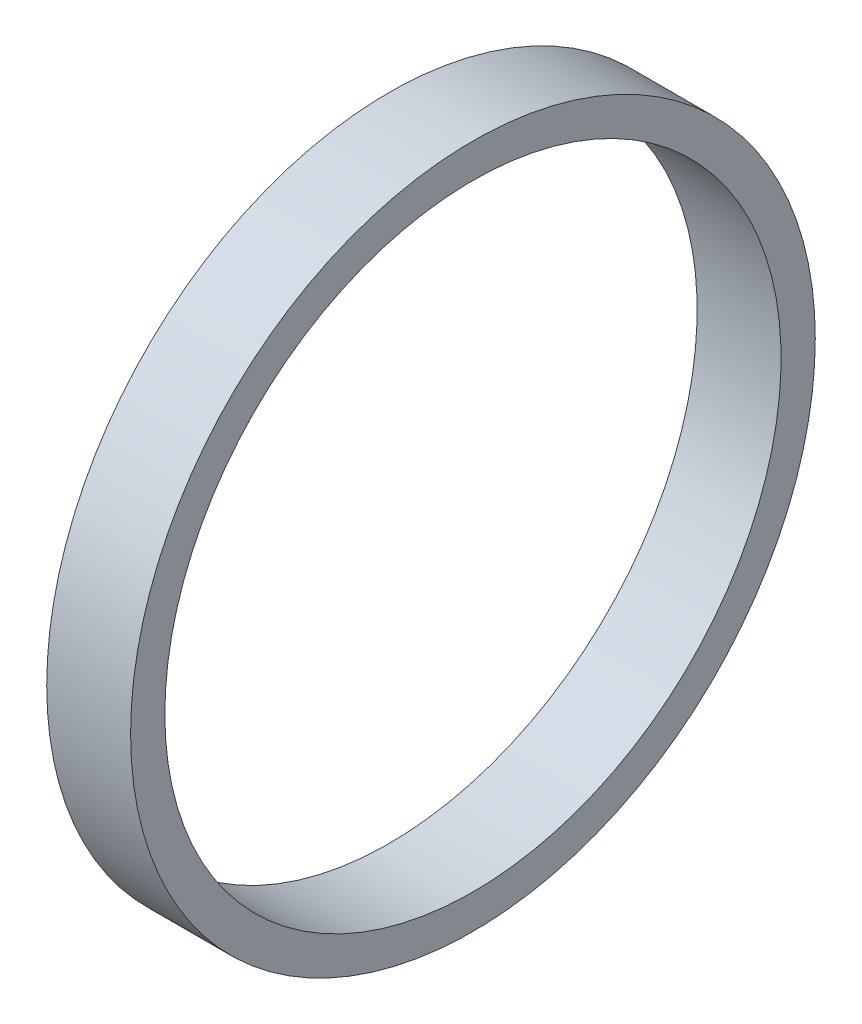
ISO-10303-21;
HEADER;
FILE_DESCRIPTION(('STEP AP214'),'2;1');
FILE_NAME('part.step','',(''),(''),'','','');
FILE_SCHEMA(('AUTOMOTIVE_DESIGN { 1 0 10303 214 1 1 1 1 }'));
ENDSEC;
DATA;
#1=APPLICATION_CONTEXT('core data for automotive mechanical design processes');
#2=APPLICATION_PROTOCOL_DEFINITION('international standard','automotive_design',2000,#1);
#3=PRODUCT_CONTEXT('',#1,'mechanical');
#4=PRODUCT('Part','Part','',(#3));
#5=PRODUCT_RELATED_PRODUCT_CATEGORY('part','',(#4));
#6=PRODUCT_DEFINITION_FORMATION('','',#4);
#7=PRODUCT_DEFINITION_CONTEXT('part definition',#1,'design');
#8=PRODUCT_DEFINITION('design','',#6,#7);
#9=PRODUCT_DEFINITION_SHAPE('','',#8);
#10=(LENGTH_UNIT() NAMED_UNIT(*) SI_UNIT(.MILLI.,.METRE.));
#11=(NAMED_UNIT(*) PLANE_ANGLE_UNIT() SI_UNIT($,.RADIAN.));
#12=(NAMED_UNIT(*) SI_UNIT($,.STERADIAN.) SOLID_ANGLE_UNIT());
#13=UNCERTAINTY_MEASURE_WITH_UNIT(LENGTH_MEASURE(1.E-05),#10,'distance_accuracy_value','');
#14=(GEOMETRIC_REPRESENTATION_CONTEXT(3) GLOBAL_UNCERTAINTY_ASSIGNED_CONTEXT((#13)) GLOBAL_UNIT_ASSIGNED_CONTEXT((#10,
#11,#12)) REPRESENTATION_CONTEXT('',''));
#15=CARTESIAN_POINT('',(0.,0.,0.));
#16=DIRECTION('',(0.,0.,1.));
#17=DIRECTION('',(1.,0.,0.));
#18=AXIS2_PLACEMENT_3D('',#15,#16,#17);
#19=CARTESIAN_POINT('',(-12.25,90.,0.));
#20=DIRECTION('',(1.,0.,0.));
#21=DIRECTION('',(0.,0.,-1.));
#22=AXIS2_PLACEMENT_3D('',#19,#20,#21);
#23=PLANE('',#22);
#24=CARTESIAN_POINT('',(-12.25,0.,0.));
#25=DIRECTION('',(-1.,0.,0.));
#26=DIRECTION('',(0.,0.,1.));
#27=AXIS2_PLACEMENT_3D('',#24,#25,#26);
#28=CIRCLE('',#27,90.);
#29=CARTESIAN_POINT('',(-12.25,0.,90.));
#30=VERTEX_POINT('',#29);
#31=EDGE_CURVE('E10',#30,#30,#28,.T.);
#32=ORIENTED_EDGE('',*,*,#31,.F.);
#33=EDGE_LOOP('',(#32));
#34=FACE_BOUND('',#33,.T.);
#35=CARTESIAN_POINT('',(-12.25,0.,0.));
#36=DIRECTION('',(-1.,0.,0.));
#37=DIRECTION('',(0.,0.,1.));
#38=AXIS2_PLACEMENT_3D('',#35,#36,#37);
#39=CIRCLE('',#38,100.);
#40=CARTESIAN_POINT('',(-12.25,0.,100.));
#41=VERTEX_POINT('',#40);
#42=EDGE_CURVE('E38',#41,#41,#39,.T.);
#43=ORIENTED_EDGE('',*,*,#42,.T.);
#44=EDGE_LOOP('',(#43));
#45=FACE_BOUND('',#44,.T.);
#46=ADVANCED_FACE('F32',(#34,#45),#23,.F.);
#47=CARTESIAN_POINT('',(0.,0.,0.));
#48=DIRECTION('',(-1.,0.,0.));
#49=DIRECTION('',(0.,0.,1.));
#50=AXIS2_PLACEMENT_3D('',#47,#48,#49);
#51=CYLINDRICAL_SURFACE('',#50,100.);
#52=ORIENTED_EDGE('',*,*,#42,.F.);
#53=EDGE_LOOP('',(#52));
#54=FACE_BOUND('',#53,.T.);
#55=CARTESIAN_POINT('',(12.25,0.,0.));
#56=DIRECTION('',(-1.,0.,0.));
#57=DIRECTION('',(0.,0.,1.));
#58=AXIS2_PLACEMENT_3D('',#55,#56,#57);
#59=CIRCLE('',#58,100.);
#60=CARTESIAN_POINT('',(12.25,0.,100.));
#61=VERTEX_POINT('',#60);
#62=EDGE_CURVE('E42',#61,#61,#59,.T.);
#63=ORIENTED_EDGE('',*,*,#62,.T.);
#64=EDGE_LOOP('',(#63));
#65=FACE_BOUND('',#64,.T.);
#66=ADVANCED_FACE('F60',(#54,#65),#51,.T.);
#67=CARTESIAN_POINT('',(12.25,100.,0.));
#68=DIRECTION('',(-1.,0.,0.));
#69=DIRECTION('',(0.,0.,1.));
#70=AXIS2_PLACEMENT_3D('',#67,#68,#69);
#71=PLANE('',#70);
#72=ORIENTED_EDGE('',*,*,#62,.F.);
#73=EDGE_LOOP('',(#72));
#74=FACE_BOUND('',#73,.T.);
#75=CARTESIAN_POINT('',(12.25,0.,0.));
#76=DIRECTION('',(-1.,0.,0.));
#77=DIRECTION('',(0.,0.,1.));
#78=AXIS2_PLACEMENT_3D('',#75,#76,#77);
#79=CIRCLE('',#78,90.);
#80=CARTESIAN_POINT('',(12.25,0.,90.));
#81=VERTEX_POINT('',#80);
#82=EDGE_CURVE('E46',#81,#81,#79,.T.);
#83=ORIENTED_EDGE('',*,*,#82,.T.);
#84=EDGE_LOOP('',(#83));
#85=FACE_BOUND('',#84,.T.);
#86=ADVANCED_FACE('F52',(#74,#85),#71,.F.);
#87=CARTESIAN_POINT('',(0.,0.,0.));
#88=DIRECTION('',(-1.,0.,0.));
#89=DIRECTION('',(0.,0.,1.));
#90=AXIS2_PLACEMENT_3D('',#87,#88,#89);
#91=CYLINDRICAL_SURFACE('',#90,90.);
#92=ORIENTED_EDGE('',*,*,#82,.F.);
#93=EDGE_LOOP('',(#92));
#94=FACE_BOUND('',#93,.T.);
#95=ORIENTED_EDGE('',*,*,#31,.T.);
#96=EDGE_LOOP('',(#95));
#97=FACE_BOUND('',#96,.T.);
#98=ADVANCED_FACE('F54',(#94,#97),#91,.F.);
#99=CLOSED_SHELL('',(#46,#66,#86,#98));
#100=MANIFOLD_SOLID_BREP('B2',#99);
#101=ADVANCED_BREP_SHAPE_REPRESENTATION('',(#18,#100),#14);
#102=SHAPE_DEFINITION_REPRESENTATION(#9,#101);
ENDSEC;
END-ISO-10303-21;
